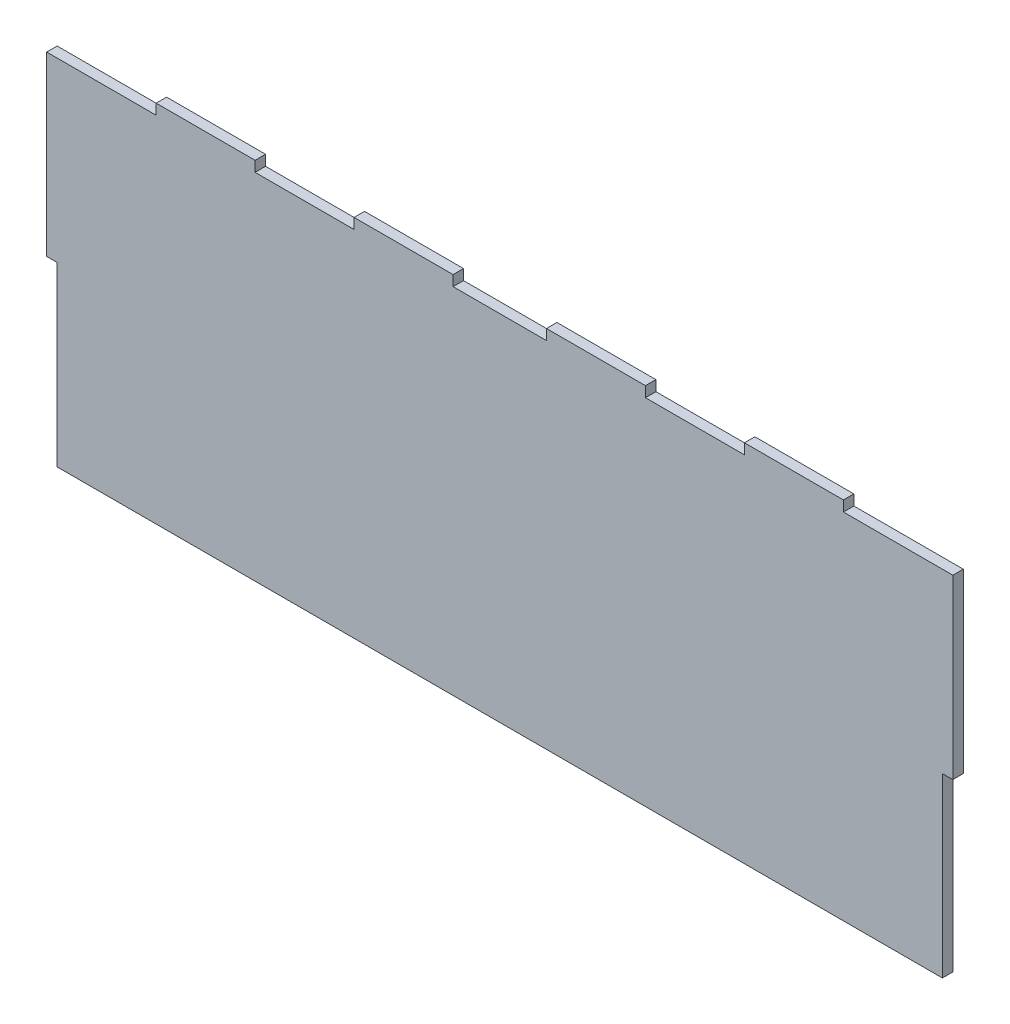
ISO-10303-21;
HEADER;
FILE_DESCRIPTION(('STEP AP214'),'2;1');
FILE_NAME('part.step','',(''),(''),'','','');
FILE_SCHEMA(('AUTOMOTIVE_DESIGN { 1 0 10303 214 1 1 1 1 }'));
ENDSEC;
DATA;
#1=APPLICATION_CONTEXT('core data for automotive mechanical design processes');
#2=APPLICATION_PROTOCOL_DEFINITION('international standard','automotive_design',2000,#1);
#3=PRODUCT_CONTEXT('',#1,'mechanical');
#4=PRODUCT('Part','Part','',(#3));
#5=PRODUCT_RELATED_PRODUCT_CATEGORY('part','',(#4));
#6=PRODUCT_DEFINITION_FORMATION('','',#4);
#7=PRODUCT_DEFINITION_CONTEXT('part definition',#1,'design');
#8=PRODUCT_DEFINITION('design','',#6,#7);
#9=PRODUCT_DEFINITION_SHAPE('','',#8);
#10=(LENGTH_UNIT() NAMED_UNIT(*) SI_UNIT(.MILLI.,.METRE.));
#11=(NAMED_UNIT(*) PLANE_ANGLE_UNIT() SI_UNIT($,.RADIAN.));
#12=(NAMED_UNIT(*) SI_UNIT($,.STERADIAN.) SOLID_ANGLE_UNIT());
#13=UNCERTAINTY_MEASURE_WITH_UNIT(LENGTH_MEASURE(1.E-05),#10,'distance_accuracy_value','');
#14=(GEOMETRIC_REPRESENTATION_CONTEXT(3) GLOBAL_UNCERTAINTY_ASSIGNED_CONTEXT((#13)) GLOBAL_UNIT_ASSIGNED_CONTEXT((#10,
#11,#12)) REPRESENTATION_CONTEXT('',''));
#15=CARTESIAN_POINT('',(0.,0.,0.));
#16=DIRECTION('',(0.,0.,1.));
#17=DIRECTION('',(1.,0.,0.));
#18=AXIS2_PLACEMENT_3D('',#15,#16,#17);
#19=CARTESIAN_POINT('',(3.00000000000001,50.8,3.));
#20=DIRECTION('',(1.,0.,0.));
#21=DIRECTION('',(0.,1.,0.));
#22=AXIS2_PLACEMENT_3D('',#19,#20,#21);
#23=PLANE('',#22);
#24=DIRECTION('',(0.,-1.,0.));
#25=VECTOR('',#24,1.);
#26=CARTESIAN_POINT('',(3.00000000000001,50.8,0.));
#27=LINE('',#26,#25);
#28=CARTESIAN_POINT('',(3.00000000000001,50.8,0.));
#29=VERTEX_POINT('',#28);
#30=CARTESIAN_POINT('',(3.00000000000002,0.,0.));
#31=VERTEX_POINT('',#30);
#32=EDGE_CURVE('E224',#29,#31,#27,.T.);
#33=ORIENTED_EDGE('',*,*,#32,.T.);
#34=DIRECTION('',(0.,0.,-1.));
#35=VECTOR('',#34,1.);
#36=CARTESIAN_POINT('',(3.00000000000002,0.,3.));
#37=LINE('',#36,#35);
#38=CARTESIAN_POINT('',(3.00000000000002,0.,3.));
#39=VERTEX_POINT('',#38);
#40=EDGE_CURVE('E11',#39,#31,#37,.T.);
#41=ORIENTED_EDGE('',*,*,#40,.F.);
#42=DIRECTION('',(0.,-1.,0.));
#43=VECTOR('',#42,1.);
#44=CARTESIAN_POINT('',(3.00000000000001,50.8,3.));
#45=LINE('',#44,#43);
#46=CARTESIAN_POINT('',(3.00000000000001,50.8,3.));
#47=VERTEX_POINT('',#46);
#48=EDGE_CURVE('E272',#47,#39,#45,.T.);
#49=ORIENTED_EDGE('',*,*,#48,.F.);
#50=DIRECTION('',(0.,0.,-1.));
#51=VECTOR('',#50,1.);
#52=CARTESIAN_POINT('',(3.00000000000001,50.8,3.));
#53=LINE('',#52,#51);
#54=EDGE_CURVE('E220',#47,#29,#53,.T.);
#55=ORIENTED_EDGE('',*,*,#54,.T.);
#56=EDGE_LOOP('',(#33,#41,#49,#55));
#57=FACE_BOUND('',#56,.T.);
#58=ADVANCED_FACE('F33',(#57),#23,.F.);
#59=CARTESIAN_POINT('',(3.00000000000002,0.,3.));
#60=DIRECTION('',(0.,1.,0.));
#61=DIRECTION('',(-1.,0.,0.));
#62=AXIS2_PLACEMENT_3D('',#59,#60,#61);
#63=PLANE('',#62);
#64=DIRECTION('',(1.,0.,0.));
#65=VECTOR('',#64,1.);
#66=CARTESIAN_POINT('',(3.00000000000002,0.,0.));
#67=LINE('',#66,#65);
#68=CARTESIAN_POINT('',(257.,0.,0.));
#69=VERTEX_POINT('',#68);
#70=EDGE_CURVE('E227',#31,#69,#67,.T.);
#71=ORIENTED_EDGE('',*,*,#70,.T.);
#72=DIRECTION('',(0.,0.,-1.));
#73=VECTOR('',#72,1.);
#74=CARTESIAN_POINT('',(257.,0.,3.));
#75=LINE('',#74,#73);
#76=CARTESIAN_POINT('',(257.,0.,3.));
#77=VERTEX_POINT('',#76);
#78=EDGE_CURVE('E41',#77,#69,#75,.T.);
#79=ORIENTED_EDGE('',*,*,#78,.F.);
#80=DIRECTION('',(1.,0.,0.));
#81=VECTOR('',#80,1.);
#82=CARTESIAN_POINT('',(3.00000000000002,0.,3.));
#83=LINE('',#82,#81);
#84=EDGE_CURVE('E140',#39,#77,#83,.T.);
#85=ORIENTED_EDGE('',*,*,#84,.F.);
#86=ORIENTED_EDGE('',*,*,#40,.T.);
#87=EDGE_LOOP('',(#71,#79,#85,#86));
#88=FACE_BOUND('',#87,.T.);
#89=ADVANCED_FACE('F410',(#88),#63,.F.);
#90=CARTESIAN_POINT('',(257.,50.8,3.));
#91=DIRECTION('',(-1.,0.,0.));
#92=DIRECTION('',(0.,0.,1.));
#93=AXIS2_PLACEMENT_3D('',#90,#91,#92);
#94=PLANE('',#93);
#95=DIRECTION('',(0.,1.,0.));
#96=VECTOR('',#95,1.);
#97=CARTESIAN_POINT('',(257.,50.8,0.));
#98=LINE('',#97,#96);
#99=CARTESIAN_POINT('',(257.,50.8,0.));
#100=VERTEX_POINT('',#99);
#101=EDGE_CURVE('E229',#69,#100,#98,.T.);
#102=ORIENTED_EDGE('',*,*,#101,.T.);
#103=DIRECTION('',(0.,0.,-1.));
#104=VECTOR('',#103,1.);
#105=CARTESIAN_POINT('',(257.,50.8,3.));
#106=LINE('',#105,#104);
#107=CARTESIAN_POINT('',(257.,50.8,3.));
#108=VERTEX_POINT('',#107);
#109=EDGE_CURVE('E327',#108,#100,#106,.T.);
#110=ORIENTED_EDGE('',*,*,#109,.F.);
#111=DIRECTION('',(0.,1.,0.));
#112=VECTOR('',#111,1.);
#113=CARTESIAN_POINT('',(257.,50.8,3.));
#114=LINE('',#113,#112);
#115=EDGE_CURVE('E335',#77,#108,#114,.T.);
#116=ORIENTED_EDGE('',*,*,#115,.F.);
#117=ORIENTED_EDGE('',*,*,#78,.T.);
#118=EDGE_LOOP('',(#102,#110,#116,#117));
#119=FACE_BOUND('',#118,.T.);
#120=ADVANCED_FACE('F333',(#119),#94,.F.);
#121=CARTESIAN_POINT('',(260.,50.8000000000002,3.));
#122=DIRECTION('',(0.,1.,0.));
#123=DIRECTION('',(-1.,0.,0.));
#124=AXIS2_PLACEMENT_3D('',#121,#122,#123);
#125=PLANE('',#124);
#126=DIRECTION('',(1.,0.,0.));
#127=VECTOR('',#126,1.);
#128=CARTESIAN_POINT('',(260.,50.8000000000002,0.));
#129=LINE('',#128,#127);
#130=CARTESIAN_POINT('',(260.,50.8000000000002,0.));
#131=VERTEX_POINT('',#130);
#132=EDGE_CURVE('E231',#100,#131,#129,.T.);
#133=ORIENTED_EDGE('',*,*,#132,.T.);
#134=DIRECTION('',(0.,0.,-1.));
#135=VECTOR('',#134,1.);
#136=CARTESIAN_POINT('',(260.,50.8000000000002,3.));
#137=LINE('',#136,#135);
#138=CARTESIAN_POINT('',(260.,50.8000000000002,3.));
#139=VERTEX_POINT('',#138);
#140=EDGE_CURVE('E324',#139,#131,#137,.T.);
#141=ORIENTED_EDGE('',*,*,#140,.F.);
#142=DIRECTION('',(1.,0.,0.));
#143=VECTOR('',#142,1.);
#144=CARTESIAN_POINT('',(260.,50.8000000000002,3.));
#145=LINE('',#144,#143);
#146=EDGE_CURVE('E352',#108,#139,#145,.T.);
#147=ORIENTED_EDGE('',*,*,#146,.F.);
#148=ORIENTED_EDGE('',*,*,#109,.T.);
#149=EDGE_LOOP('',(#133,#141,#147,#148));
#150=FACE_BOUND('',#149,.T.);
#151=ADVANCED_FACE('F343',(#150),#125,.F.);
#152=CARTESIAN_POINT('',(260.,101.6,3.));
#153=DIRECTION('',(-1.,0.,0.));
#154=DIRECTION('',(0.,-1.,0.));
#155=AXIS2_PLACEMENT_3D('',#152,#153,#154);
#156=PLANE('',#155);
#157=DIRECTION('',(0.,1.,0.));
#158=VECTOR('',#157,1.);
#159=CARTESIAN_POINT('',(260.,101.6,0.));
#160=LINE('',#159,#158);
#161=CARTESIAN_POINT('',(260.,101.6,0.));
#162=VERTEX_POINT('',#161);
#163=EDGE_CURVE('E233',#131,#162,#160,.T.);
#164=ORIENTED_EDGE('',*,*,#163,.T.);
#165=DIRECTION('',(0.,0.,-1.));
#166=VECTOR('',#165,1.);
#167=CARTESIAN_POINT('',(260.,101.6,3.));
#168=LINE('',#167,#166);
#169=CARTESIAN_POINT('',(260.,101.6,3.));
#170=VERTEX_POINT('',#169);
#171=EDGE_CURVE('E321',#170,#162,#168,.T.);
#172=ORIENTED_EDGE('',*,*,#171,.F.);
#173=DIRECTION('',(0.,1.,0.));
#174=VECTOR('',#173,1.);
#175=CARTESIAN_POINT('',(260.,101.6,3.));
#176=LINE('',#175,#174);
#177=EDGE_CURVE('E349',#139,#170,#176,.T.);
#178=ORIENTED_EDGE('',*,*,#177,.F.);
#179=ORIENTED_EDGE('',*,*,#140,.T.);
#180=EDGE_LOOP('',(#164,#172,#178,#179));
#181=FACE_BOUND('',#180,.T.);
#182=ADVANCED_FACE('F347',(#181),#156,.F.);
#183=CARTESIAN_POINT('',(257.,101.6,3.));
#184=DIRECTION('',(0.,-1.,0.));
#185=DIRECTION('',(0.,0.,-1.));
#186=AXIS2_PLACEMENT_3D('',#183,#184,#185);
#187=PLANE('',#186);
#188=DIRECTION('',(-1.,0.,0.));
#189=VECTOR('',#188,1.);
#190=CARTESIAN_POINT('',(257.,101.6,0.));
#191=LINE('',#190,#189);
#192=CARTESIAN_POINT('',(228.6,101.6,0.));
#193=VERTEX_POINT('',#192);
#194=EDGE_CURVE('E236',#162,#193,#191,.T.);
#195=ORIENTED_EDGE('',*,*,#194,.T.);
#196=DIRECTION('',(0.,0.,-1.));
#197=VECTOR('',#196,1.);
#198=CARTESIAN_POINT('',(228.6,101.6,3.));
#199=LINE('',#198,#197);
#200=CARTESIAN_POINT('',(228.6,101.6,3.));
#201=VERTEX_POINT('',#200);
#202=EDGE_CURVE('E318',#201,#193,#199,.T.);
#203=ORIENTED_EDGE('',*,*,#202,.F.);
#204=DIRECTION('',(-1.,0.,0.));
#205=VECTOR('',#204,1.);
#206=CARTESIAN_POINT('',(260.,101.6,3.));
#207=LINE('',#206,#205);
#208=EDGE_CURVE('E351',#170,#201,#207,.T.);
#209=ORIENTED_EDGE('',*,*,#208,.F.);
#210=ORIENTED_EDGE('',*,*,#171,.T.);
#211=EDGE_LOOP('',(#195,#203,#209,#210));
#212=FACE_BOUND('',#211,.T.);
#213=ADVANCED_FACE('F423',(#212),#187,.F.);
#214=CARTESIAN_POINT('',(228.6,101.6,3.));
#215=DIRECTION('',(-1.,0.,0.));
#216=DIRECTION('',(0.,0.,1.));
#217=AXIS2_PLACEMENT_3D('',#214,#215,#216);
#218=PLANE('',#217);
#219=DIRECTION('',(0.,1.,0.));
#220=VECTOR('',#219,1.);
#221=CARTESIAN_POINT('',(228.6,101.6,0.));
#222=LINE('',#221,#220);
#223=CARTESIAN_POINT('',(228.6,104.6,0.));
#224=VERTEX_POINT('',#223);
#225=EDGE_CURVE('E238',#193,#224,#222,.T.);
#226=ORIENTED_EDGE('',*,*,#225,.T.);
#227=DIRECTION('',(0.,0.,-1.));
#228=VECTOR('',#227,1.);
#229=CARTESIAN_POINT('',(228.6,104.6,3.));
#230=LINE('',#229,#228);
#231=CARTESIAN_POINT('',(228.6,104.6,3.));
#232=VERTEX_POINT('',#231);
#233=EDGE_CURVE('E315',#232,#224,#230,.T.);
#234=ORIENTED_EDGE('',*,*,#233,.F.);
#235=DIRECTION('',(0.,1.,0.));
#236=VECTOR('',#235,1.);
#237=CARTESIAN_POINT('',(228.6,101.6,3.));
#238=LINE('',#237,#236);
#239=EDGE_CURVE('E354',#201,#232,#238,.T.);
#240=ORIENTED_EDGE('',*,*,#239,.F.);
#241=ORIENTED_EDGE('',*,*,#202,.T.);
#242=EDGE_LOOP('',(#226,#234,#240,#241));
#243=FACE_BOUND('',#242,.T.);
#244=ADVANCED_FACE('F426',(#243),#218,.F.);
#245=CARTESIAN_POINT('',(228.6,104.6,3.));
#246=DIRECTION('',(0.,-1.,0.));
#247=DIRECTION('',(0.,0.,-1.));
#248=AXIS2_PLACEMENT_3D('',#245,#246,#247);
#249=PLANE('',#248);
#250=DIRECTION('',(-1.,0.,0.));
#251=VECTOR('',#250,1.);
#252=CARTESIAN_POINT('',(228.6,104.6,0.));
#253=LINE('',#252,#251);
#254=CARTESIAN_POINT('',(200.2,104.6,0.));
#255=VERTEX_POINT('',#254);
#256=EDGE_CURVE('E240',#224,#255,#253,.T.);
#257=ORIENTED_EDGE('',*,*,#256,.T.);
#258=DIRECTION('',(0.,0.,-1.));
#259=VECTOR('',#258,1.);
#260=CARTESIAN_POINT('',(200.2,104.6,3.));
#261=LINE('',#260,#259);
#262=CARTESIAN_POINT('',(200.2,104.6,3.));
#263=VERTEX_POINT('',#262);
#264=EDGE_CURVE('E312',#263,#255,#261,.T.);
#265=ORIENTED_EDGE('',*,*,#264,.F.);
#266=DIRECTION('',(-1.,0.,0.));
#267=VECTOR('',#266,1.);
#268=CARTESIAN_POINT('',(228.6,104.6,3.));
#269=LINE('',#268,#267);
#270=EDGE_CURVE('E360',#232,#263,#269,.T.);
#271=ORIENTED_EDGE('',*,*,#270,.F.);
#272=ORIENTED_EDGE('',*,*,#233,.T.);
#273=EDGE_LOOP('',(#257,#265,#271,#272));
#274=FACE_BOUND('',#273,.T.);
#275=ADVANCED_FACE('F430',(#274),#249,.F.);
#276=CARTESIAN_POINT('',(200.2,104.6,3.));
#277=DIRECTION('',(1.,0.,0.));
#278=DIRECTION('',(0.,0.,-1.));
#279=AXIS2_PLACEMENT_3D('',#276,#277,#278);
#280=PLANE('',#279);
#281=DIRECTION('',(0.,-1.,0.));
#282=VECTOR('',#281,1.);
#283=CARTESIAN_POINT('',(200.2,104.6,0.));
#284=LINE('',#283,#282);
#285=CARTESIAN_POINT('',(200.2,101.6,0.));
#286=VERTEX_POINT('',#285);
#287=EDGE_CURVE('E242',#255,#286,#284,.T.);
#288=ORIENTED_EDGE('',*,*,#287,.T.);
#289=DIRECTION('',(0.,0.,-1.));
#290=VECTOR('',#289,1.);
#291=CARTESIAN_POINT('',(200.2,101.6,3.));
#292=LINE('',#291,#290);
#293=CARTESIAN_POINT('',(200.2,101.6,3.));
#294=VERTEX_POINT('',#293);
#295=EDGE_CURVE('E309',#294,#286,#292,.T.);
#296=ORIENTED_EDGE('',*,*,#295,.F.);
#297=DIRECTION('',(0.,-1.,0.));
#298=VECTOR('',#297,1.);
#299=CARTESIAN_POINT('',(200.2,104.6,3.));
#300=LINE('',#299,#298);
#301=EDGE_CURVE('E362',#263,#294,#300,.T.);
#302=ORIENTED_EDGE('',*,*,#301,.F.);
#303=ORIENTED_EDGE('',*,*,#264,.T.);
#304=EDGE_LOOP('',(#288,#296,#302,#303));
#305=FACE_BOUND('',#304,.T.);
#306=ADVANCED_FACE('F434',(#305),#280,.F.);
#307=CARTESIAN_POINT('',(200.2,101.6,3.));
#308=DIRECTION('',(0.,-1.,0.));
#309=DIRECTION('',(0.,0.,-1.));
#310=AXIS2_PLACEMENT_3D('',#307,#308,#309);
#311=PLANE('',#310);
#312=DIRECTION('',(-1.,0.,0.));
#313=VECTOR('',#312,1.);
#314=CARTESIAN_POINT('',(200.2,101.6,0.));
#315=LINE('',#314,#313);
#316=CARTESIAN_POINT('',(171.8,101.6,0.));
#317=VERTEX_POINT('',#316);
#318=EDGE_CURVE('E244',#286,#317,#315,.T.);
#319=ORIENTED_EDGE('',*,*,#318,.T.);
#320=DIRECTION('',(0.,0.,-1.));
#321=VECTOR('',#320,1.);
#322=CARTESIAN_POINT('',(171.8,101.6,3.));
#323=LINE('',#322,#321);
#324=CARTESIAN_POINT('',(171.8,101.6,3.));
#325=VERTEX_POINT('',#324);
#326=EDGE_CURVE('E306',#325,#317,#323,.T.);
#327=ORIENTED_EDGE('',*,*,#326,.F.);
#328=DIRECTION('',(-1.,0.,0.));
#329=VECTOR('',#328,1.);
#330=CARTESIAN_POINT('',(200.2,101.6,3.));
#331=LINE('',#330,#329);
#332=EDGE_CURVE('E364',#294,#325,#331,.T.);
#333=ORIENTED_EDGE('',*,*,#332,.F.);
#334=ORIENTED_EDGE('',*,*,#295,.T.);
#335=EDGE_LOOP('',(#319,#327,#333,#334));
#336=FACE_BOUND('',#335,.T.);
#337=ADVANCED_FACE('F438',(#336),#311,.F.);
#338=CARTESIAN_POINT('',(171.8,101.6,3.));
#339=DIRECTION('',(-1.,0.,0.));
#340=DIRECTION('',(0.,-1.,0.));
#341=AXIS2_PLACEMENT_3D('',#338,#339,#340);
#342=PLANE('',#341);
#343=DIRECTION('',(0.,1.,0.));
#344=VECTOR('',#343,1.);
#345=CARTESIAN_POINT('',(171.8,101.6,0.));
#346=LINE('',#345,#344);
#347=CARTESIAN_POINT('',(171.8,104.6,0.));
#348=VERTEX_POINT('',#347);
#349=EDGE_CURVE('E246',#317,#348,#346,.T.);
#350=ORIENTED_EDGE('',*,*,#349,.T.);
#351=DIRECTION('',(0.,0.,-1.));
#352=VECTOR('',#351,1.);
#353=CARTESIAN_POINT('',(171.8,104.6,3.));
#354=LINE('',#353,#352);
#355=CARTESIAN_POINT('',(171.8,104.6,3.));
#356=VERTEX_POINT('',#355);
#357=EDGE_CURVE('E303',#356,#348,#354,.T.);
#358=ORIENTED_EDGE('',*,*,#357,.F.);
#359=DIRECTION('',(0.,1.,0.));
#360=VECTOR('',#359,1.);
#361=CARTESIAN_POINT('',(171.8,101.6,3.));
#362=LINE('',#361,#360);
#363=EDGE_CURVE('E366',#325,#356,#362,.T.);
#364=ORIENTED_EDGE('',*,*,#363,.F.);
#365=ORIENTED_EDGE('',*,*,#326,.T.);
#366=EDGE_LOOP('',(#350,#358,#364,#365));
#367=FACE_BOUND('',#366,.T.);
#368=ADVANCED_FACE('F442',(#367),#342,.F.);
#369=CARTESIAN_POINT('',(171.8,104.6,3.));
#370=DIRECTION('',(0.,-1.,0.));
#371=DIRECTION('',(0.,0.,-1.));
#372=AXIS2_PLACEMENT_3D('',#369,#370,#371);
#373=PLANE('',#372);
#374=DIRECTION('',(-1.,0.,0.));
#375=VECTOR('',#374,1.);
#376=CARTESIAN_POINT('',(171.8,104.6,0.));
#377=LINE('',#376,#375);
#378=CARTESIAN_POINT('',(143.4,104.6,0.));
#379=VERTEX_POINT('',#378);
#380=EDGE_CURVE('E248',#348,#379,#377,.T.);
#381=ORIENTED_EDGE('',*,*,#380,.T.);
#382=DIRECTION('',(0.,0.,-1.));
#383=VECTOR('',#382,1.);
#384=CARTESIAN_POINT('',(143.4,104.6,3.));
#385=LINE('',#384,#383);
#386=CARTESIAN_POINT('',(143.4,104.6,3.));
#387=VERTEX_POINT('',#386);
#388=EDGE_CURVE('E300',#387,#379,#385,.T.);
#389=ORIENTED_EDGE('',*,*,#388,.F.);
#390=DIRECTION('',(-1.,0.,0.));
#391=VECTOR('',#390,1.);
#392=CARTESIAN_POINT('',(171.8,104.6,3.));
#393=LINE('',#392,#391);
#394=EDGE_CURVE('E368',#356,#387,#393,.T.);
#395=ORIENTED_EDGE('',*,*,#394,.F.);
#396=ORIENTED_EDGE('',*,*,#357,.T.);
#397=EDGE_LOOP('',(#381,#389,#395,#396));
#398=FACE_BOUND('',#397,.T.);
#399=ADVANCED_FACE('F446',(#398),#373,.F.);
#400=CARTESIAN_POINT('',(143.4,104.6,3.));
#401=DIRECTION('',(1.,0.,0.));
#402=DIRECTION('',(0.,0.,-1.));
#403=AXIS2_PLACEMENT_3D('',#400,#401,#402);
#404=PLANE('',#403);
#405=DIRECTION('',(0.,-1.,0.));
#406=VECTOR('',#405,1.);
#407=CARTESIAN_POINT('',(143.4,104.6,0.));
#408=LINE('',#407,#406);
#409=CARTESIAN_POINT('',(143.4,101.6,0.));
#410=VERTEX_POINT('',#409);
#411=EDGE_CURVE('E250',#379,#410,#408,.T.);
#412=ORIENTED_EDGE('',*,*,#411,.T.);
#413=DIRECTION('',(0.,0.,-1.));
#414=VECTOR('',#413,1.);
#415=CARTESIAN_POINT('',(143.4,101.6,3.));
#416=LINE('',#415,#414);
#417=CARTESIAN_POINT('',(143.4,101.6,3.));
#418=VERTEX_POINT('',#417);
#419=EDGE_CURVE('E297',#418,#410,#416,.T.);
#420=ORIENTED_EDGE('',*,*,#419,.F.);
#421=DIRECTION('',(0.,-1.,0.));
#422=VECTOR('',#421,1.);
#423=CARTESIAN_POINT('',(143.4,104.6,3.));
#424=LINE('',#423,#422);
#425=EDGE_CURVE('E370',#387,#418,#424,.T.);
#426=ORIENTED_EDGE('',*,*,#425,.F.);
#427=ORIENTED_EDGE('',*,*,#388,.T.);
#428=EDGE_LOOP('',(#412,#420,#426,#427));
#429=FACE_BOUND('',#428,.T.);
#430=ADVANCED_FACE('F450',(#429),#404,.F.);
#431=CARTESIAN_POINT('',(116.6,101.6,3.));
#432=DIRECTION('',(0.,-1.,0.));
#433=DIRECTION('',(0.,0.,-1.));
#434=AXIS2_PLACEMENT_3D('',#431,#432,#433);
#435=PLANE('',#434);
#436=DIRECTION('',(-1.,0.,0.));
#437=VECTOR('',#436,1.);
#438=CARTESIAN_POINT('',(116.6,101.6,0.));
#439=LINE('',#438,#437);
#440=CARTESIAN_POINT('',(116.6,101.6,0.));
#441=VERTEX_POINT('',#440);
#442=EDGE_CURVE('E252',#410,#441,#439,.T.);
#443=ORIENTED_EDGE('',*,*,#442,.T.);
#444=DIRECTION('',(0.,0.,-1.));
#445=VECTOR('',#444,1.);
#446=CARTESIAN_POINT('',(116.6,101.6,3.));
#447=LINE('',#446,#445);
#448=CARTESIAN_POINT('',(116.6,101.6,3.));
#449=VERTEX_POINT('',#448);
#450=EDGE_CURVE('E294',#449,#441,#447,.T.);
#451=ORIENTED_EDGE('',*,*,#450,.F.);
#452=DIRECTION('',(-1.,0.,0.));
#453=VECTOR('',#452,1.);
#454=CARTESIAN_POINT('',(116.6,101.6,3.));
#455=LINE('',#454,#453);
#456=EDGE_CURVE('E372',#418,#449,#455,.T.);
#457=ORIENTED_EDGE('',*,*,#456,.F.);
#458=ORIENTED_EDGE('',*,*,#419,.T.);
#459=EDGE_LOOP('',(#443,#451,#457,#458));
#460=FACE_BOUND('',#459,.T.);
#461=ADVANCED_FACE('F454',(#460),#435,.F.);
#462=CARTESIAN_POINT('',(116.6,104.6,3.));
#463=DIRECTION('',(-1.,0.,0.));
#464=DIRECTION('',(0.,-1.,0.));
#465=AXIS2_PLACEMENT_3D('',#462,#463,#464);
#466=PLANE('',#465);
#467=DIRECTION('',(0.,1.,0.));
#468=VECTOR('',#467,1.);
#469=CARTESIAN_POINT('',(116.6,104.6,0.));
#470=LINE('',#469,#468);
#471=CARTESIAN_POINT('',(116.6,104.6,0.));
#472=VERTEX_POINT('',#471);
#473=EDGE_CURVE('E254',#441,#472,#470,.T.);
#474=ORIENTED_EDGE('',*,*,#473,.T.);
#475=DIRECTION('',(0.,0.,-1.));
#476=VECTOR('',#475,1.);
#477=CARTESIAN_POINT('',(116.6,104.6,3.));
#478=LINE('',#477,#476);
#479=CARTESIAN_POINT('',(116.6,104.6,3.));
#480=VERTEX_POINT('',#479);
#481=EDGE_CURVE('E291',#480,#472,#478,.T.);
#482=ORIENTED_EDGE('',*,*,#481,.F.);
#483=DIRECTION('',(0.,1.,0.));
#484=VECTOR('',#483,1.);
#485=CARTESIAN_POINT('',(116.6,104.6,3.));
#486=LINE('',#485,#484);
#487=EDGE_CURVE('E374',#449,#480,#486,.T.);
#488=ORIENTED_EDGE('',*,*,#487,.F.);
#489=ORIENTED_EDGE('',*,*,#450,.T.);
#490=EDGE_LOOP('',(#474,#482,#488,#489));
#491=FACE_BOUND('',#490,.T.);
#492=ADVANCED_FACE('F458',(#491),#466,.F.);
#493=CARTESIAN_POINT('',(88.2,104.6,3.));
#494=DIRECTION('',(0.,-1.,0.));
#495=DIRECTION('',(0.,0.,-1.));
#496=AXIS2_PLACEMENT_3D('',#493,#494,#495);
#497=PLANE('',#496);
#498=DIRECTION('',(-1.,0.,0.));
#499=VECTOR('',#498,1.);
#500=CARTESIAN_POINT('',(88.2,104.6,0.));
#501=LINE('',#500,#499);
#502=CARTESIAN_POINT('',(88.2,104.6,0.));
#503=VERTEX_POINT('',#502);
#504=EDGE_CURVE('E256',#472,#503,#501,.T.);
#505=ORIENTED_EDGE('',*,*,#504,.T.);
#506=DIRECTION('',(0.,0.,-1.));
#507=VECTOR('',#506,1.);
#508=CARTESIAN_POINT('',(88.2,104.6,3.));
#509=LINE('',#508,#507);
#510=CARTESIAN_POINT('',(88.2,104.6,3.));
#511=VERTEX_POINT('',#510);
#512=EDGE_CURVE('E288',#511,#503,#509,.T.);
#513=ORIENTED_EDGE('',*,*,#512,.F.);
#514=DIRECTION('',(-1.,0.,0.));
#515=VECTOR('',#514,1.);
#516=CARTESIAN_POINT('',(88.2,104.6,3.));
#517=LINE('',#516,#515);
#518=EDGE_CURVE('E376',#480,#511,#517,.T.);
#519=ORIENTED_EDGE('',*,*,#518,.F.);
#520=ORIENTED_EDGE('',*,*,#481,.T.);
#521=EDGE_LOOP('',(#505,#513,#519,#520));
#522=FACE_BOUND('',#521,.T.);
#523=ADVANCED_FACE('F462',(#522),#497,.F.);
#524=CARTESIAN_POINT('',(88.2,101.6,3.));
#525=DIRECTION('',(1.,0.,0.));
#526=DIRECTION('',(0.,1.,0.));
#527=AXIS2_PLACEMENT_3D('',#524,#525,#526);
#528=PLANE('',#527);
#529=DIRECTION('',(0.,-1.,0.));
#530=VECTOR('',#529,1.);
#531=CARTESIAN_POINT('',(88.2,101.6,0.));
#532=LINE('',#531,#530);
#533=CARTESIAN_POINT('',(88.2,101.6,0.));
#534=VERTEX_POINT('',#533);
#535=EDGE_CURVE('E258',#503,#534,#532,.T.);
#536=ORIENTED_EDGE('',*,*,#535,.T.);
#537=DIRECTION('',(0.,0.,-1.));
#538=VECTOR('',#537,1.);
#539=CARTESIAN_POINT('',(88.2,101.6,3.));
#540=LINE('',#539,#538);
#541=CARTESIAN_POINT('',(88.2,101.6,3.));
#542=VERTEX_POINT('',#541);
#543=EDGE_CURVE('E285',#542,#534,#540,.T.);
#544=ORIENTED_EDGE('',*,*,#543,.F.);
#545=DIRECTION('',(0.,-1.,0.));
#546=VECTOR('',#545,1.);
#547=CARTESIAN_POINT('',(88.2,101.6,3.));
#548=LINE('',#547,#546);
#549=EDGE_CURVE('E378',#511,#542,#548,.T.);
#550=ORIENTED_EDGE('',*,*,#549,.F.);
#551=ORIENTED_EDGE('',*,*,#512,.T.);
#552=EDGE_LOOP('',(#536,#544,#550,#551));
#553=FACE_BOUND('',#552,.T.);
#554=ADVANCED_FACE('F466',(#553),#528,.F.);
#555=CARTESIAN_POINT('',(59.8,101.6,3.));
#556=DIRECTION('',(0.,-1.,0.));
#557=DIRECTION('',(0.,0.,-1.));
#558=AXIS2_PLACEMENT_3D('',#555,#556,#557);
#559=PLANE('',#558);
#560=DIRECTION('',(-1.,0.,0.));
#561=VECTOR('',#560,1.);
#562=CARTESIAN_POINT('',(59.8,101.6,0.));
#563=LINE('',#562,#561);
#564=CARTESIAN_POINT('',(59.8,101.6,0.));
#565=VERTEX_POINT('',#564);
#566=EDGE_CURVE('E260',#534,#565,#563,.T.);
#567=ORIENTED_EDGE('',*,*,#566,.T.);
#568=DIRECTION('',(0.,0.,-1.));
#569=VECTOR('',#568,1.);
#570=CARTESIAN_POINT('',(59.8,101.6,3.));
#571=LINE('',#570,#569);
#572=CARTESIAN_POINT('',(59.8,101.6,3.));
#573=VERTEX_POINT('',#572);
#574=EDGE_CURVE('E282',#573,#565,#571,.T.);
#575=ORIENTED_EDGE('',*,*,#574,.F.);
#576=DIRECTION('',(-1.,0.,0.));
#577=VECTOR('',#576,1.);
#578=CARTESIAN_POINT('',(59.8,101.6,3.));
#579=LINE('',#578,#577);
#580=EDGE_CURVE('E380',#542,#573,#579,.T.);
#581=ORIENTED_EDGE('',*,*,#580,.F.);
#582=ORIENTED_EDGE('',*,*,#543,.T.);
#583=EDGE_LOOP('',(#567,#575,#581,#582));
#584=FACE_BOUND('',#583,.T.);
#585=ADVANCED_FACE('F470',(#584),#559,.F.);
#586=CARTESIAN_POINT('',(59.8,104.6,3.));
#587=DIRECTION('',(-1.,0.,0.));
#588=DIRECTION('',(0.,0.,1.));
#589=AXIS2_PLACEMENT_3D('',#586,#587,#588);
#590=PLANE('',#589);
#591=DIRECTION('',(0.,1.,0.));
#592=VECTOR('',#591,1.);
#593=CARTESIAN_POINT('',(59.8,104.6,0.));
#594=LINE('',#593,#592);
#595=CARTESIAN_POINT('',(59.8,104.6,0.));
#596=VERTEX_POINT('',#595);
#597=EDGE_CURVE('E262',#565,#596,#594,.T.);
#598=ORIENTED_EDGE('',*,*,#597,.T.);
#599=DIRECTION('',(0.,0.,-1.));
#600=VECTOR('',#599,1.);
#601=CARTESIAN_POINT('',(59.8,104.6,3.));
#602=LINE('',#601,#600);
#603=CARTESIAN_POINT('',(59.8,104.6,3.));
#604=VERTEX_POINT('',#603);
#605=EDGE_CURVE('E279',#604,#596,#602,.T.);
#606=ORIENTED_EDGE('',*,*,#605,.F.);
#607=DIRECTION('',(0.,1.,0.));
#608=VECTOR('',#607,1.);
#609=CARTESIAN_POINT('',(59.8,104.6,3.));
#610=LINE('',#609,#608);
#611=EDGE_CURVE('E382',#573,#604,#610,.T.);
#612=ORIENTED_EDGE('',*,*,#611,.F.);
#613=ORIENTED_EDGE('',*,*,#574,.T.);
#614=EDGE_LOOP('',(#598,#606,#612,#613));
#615=FACE_BOUND('',#614,.T.);
#616=ADVANCED_FACE('F474',(#615),#590,.F.);
#617=CARTESIAN_POINT('',(31.4,104.6,3.));
#618=DIRECTION('',(0.,-1.,0.));
#619=DIRECTION('',(0.,0.,-1.));
#620=AXIS2_PLACEMENT_3D('',#617,#618,#619);
#621=PLANE('',#620);
#622=DIRECTION('',(-1.,0.,0.));
#623=VECTOR('',#622,1.);
#624=CARTESIAN_POINT('',(31.4,104.6,0.));
#625=LINE('',#624,#623);
#626=CARTESIAN_POINT('',(31.4,104.6,0.));
#627=VERTEX_POINT('',#626);
#628=EDGE_CURVE('E264',#596,#627,#625,.T.);
#629=ORIENTED_EDGE('',*,*,#628,.T.);
#630=DIRECTION('',(0.,0.,-1.));
#631=VECTOR('',#630,1.);
#632=CARTESIAN_POINT('',(31.4,104.6,3.));
#633=LINE('',#632,#631);
#634=CARTESIAN_POINT('',(31.4,104.6,3.));
#635=VERTEX_POINT('',#634);
#636=EDGE_CURVE('E276',#635,#627,#633,.T.);
#637=ORIENTED_EDGE('',*,*,#636,.F.);
#638=DIRECTION('',(-1.,0.,0.));
#639=VECTOR('',#638,1.);
#640=CARTESIAN_POINT('',(31.4,104.6,3.));
#641=LINE('',#640,#639);
#642=EDGE_CURVE('E384',#604,#635,#641,.T.);
#643=ORIENTED_EDGE('',*,*,#642,.F.);
#644=ORIENTED_EDGE('',*,*,#605,.T.);
#645=EDGE_LOOP('',(#629,#637,#643,#644));
#646=FACE_BOUND('',#645,.T.);
#647=ADVANCED_FACE('F390',(#646),#621,.F.);
#648=CARTESIAN_POINT('',(31.4,101.6,3.));
#649=DIRECTION('',(1.,0.,0.));
#650=DIRECTION('',(0.,0.,-1.));
#651=AXIS2_PLACEMENT_3D('',#648,#649,#650);
#652=PLANE('',#651);
#653=DIRECTION('',(0.,-1.,0.));
#654=VECTOR('',#653,1.);
#655=CARTESIAN_POINT('',(31.4,101.6,0.));
#656=LINE('',#655,#654);
#657=CARTESIAN_POINT('',(31.4,101.6,0.));
#658=VERTEX_POINT('',#657);
#659=EDGE_CURVE('E266',#627,#658,#656,.T.);
#660=ORIENTED_EDGE('',*,*,#659,.T.);
#661=DIRECTION('',(0.,0.,-1.));
#662=VECTOR('',#661,1.);
#663=CARTESIAN_POINT('',(31.4,101.6,3.));
#664=LINE('',#663,#662);
#665=CARTESIAN_POINT('',(31.4,101.6,3.));
#666=VERTEX_POINT('',#665);
#667=EDGE_CURVE('E215',#666,#658,#664,.T.);
#668=ORIENTED_EDGE('',*,*,#667,.F.);
#669=DIRECTION('',(0.,-1.,0.));
#670=VECTOR('',#669,1.);
#671=CARTESIAN_POINT('',(31.4,101.6,3.));
#672=LINE('',#671,#670);
#673=EDGE_CURVE('E207',#635,#666,#672,.T.);
#674=ORIENTED_EDGE('',*,*,#673,.F.);
#675=ORIENTED_EDGE('',*,*,#636,.T.);
#676=EDGE_LOOP('',(#660,#668,#674,#675));
#677=FACE_BOUND('',#676,.T.);
#678=ADVANCED_FACE('F394',(#677),#652,.F.);
#679=CARTESIAN_POINT('',(0.,101.6,3.));
#680=DIRECTION('',(0.,-1.,0.));
#681=DIRECTION('',(0.,0.,-1.));
#682=AXIS2_PLACEMENT_3D('',#679,#680,#681);
#683=PLANE('',#682);
#684=DIRECTION('',(-1.,0.,0.));
#685=VECTOR('',#684,1.);
#686=CARTESIAN_POINT('',(0.,101.6,0.));
#687=LINE('',#686,#685);
#688=CARTESIAN_POINT('',(0.,101.6,0.));
#689=VERTEX_POINT('',#688);
#690=EDGE_CURVE('E214',#658,#689,#687,.T.);
#691=ORIENTED_EDGE('',*,*,#690,.T.);
#692=DIRECTION('',(0.,0.,-1.));
#693=VECTOR('',#692,1.);
#694=CARTESIAN_POINT('',(0.,101.6,3.));
#695=LINE('',#694,#693);
#696=CARTESIAN_POINT('',(0.,101.6,3.));
#697=VERTEX_POINT('',#696);
#698=EDGE_CURVE('E212',#697,#689,#695,.T.);
#699=ORIENTED_EDGE('',*,*,#698,.F.);
#700=DIRECTION('',(-1.,0.,0.));
#701=VECTOR('',#700,1.);
#702=CARTESIAN_POINT('',(2.99999999999998,101.6,3.));
#703=LINE('',#702,#701);
#704=EDGE_CURVE('E201',#666,#697,#703,.T.);
#705=ORIENTED_EDGE('',*,*,#704,.F.);
#706=ORIENTED_EDGE('',*,*,#667,.T.);
#707=EDGE_LOOP('',(#691,#699,#705,#706));
#708=FACE_BOUND('',#707,.T.);
#709=ADVANCED_FACE('F213',(#708),#683,.F.);
#710=CARTESIAN_POINT('',(0.,101.6,3.));
#711=DIRECTION('',(1.,0.,0.));
#712=DIRECTION('',(0.,1.,0.));
#713=AXIS2_PLACEMENT_3D('',#710,#711,#712);
#714=PLANE('',#713);
#715=DIRECTION('',(0.,-1.,0.));
#716=VECTOR('',#715,1.);
#717=CARTESIAN_POINT('',(0.,101.6,0.));
#718=LINE('',#717,#716);
#719=CARTESIAN_POINT('',(0.,50.8,0.));
#720=VERTEX_POINT('',#719);
#721=EDGE_CURVE('E126',#689,#720,#718,.T.);
#722=ORIENTED_EDGE('',*,*,#721,.T.);
#723=DIRECTION('',(0.,0.,-1.));
#724=VECTOR('',#723,1.);
#725=CARTESIAN_POINT('',(0.,50.8,3.));
#726=LINE('',#725,#724);
#727=CARTESIAN_POINT('',(0.,50.8,3.));
#728=VERTEX_POINT('',#727);
#729=EDGE_CURVE('E216',#728,#720,#726,.T.);
#730=ORIENTED_EDGE('',*,*,#729,.F.);
#731=DIRECTION('',(0.,-1.,0.));
#732=VECTOR('',#731,1.);
#733=CARTESIAN_POINT('',(0.,101.6,3.));
#734=LINE('',#733,#732);
#735=EDGE_CURVE('E205',#697,#728,#734,.T.);
#736=ORIENTED_EDGE('',*,*,#735,.F.);
#737=ORIENTED_EDGE('',*,*,#698,.T.);
#738=EDGE_LOOP('',(#722,#730,#736,#737));
#739=FACE_BOUND('',#738,.T.);
#740=ADVANCED_FACE('F218',(#739),#714,.F.);
#741=CARTESIAN_POINT('',(0.,50.8,3.));
#742=DIRECTION('',(0.,1.,0.));
#743=DIRECTION('',(0.,0.,1.));
#744=AXIS2_PLACEMENT_3D('',#741,#742,#743);
#745=PLANE('',#744);
#746=DIRECTION('',(1.,0.,0.));
#747=VECTOR('',#746,1.);
#748=CARTESIAN_POINT('',(0.,50.8,0.));
#749=LINE('',#748,#747);
#750=EDGE_CURVE('E132',#720,#29,#749,.T.);
#751=ORIENTED_EDGE('',*,*,#750,.T.);
#752=ORIENTED_EDGE('',*,*,#54,.F.);
#753=DIRECTION('',(1.,0.,0.));
#754=VECTOR('',#753,1.);
#755=CARTESIAN_POINT('',(0.,50.8,3.));
#756=LINE('',#755,#754);
#757=EDGE_CURVE('E49',#728,#47,#756,.T.);
#758=ORIENTED_EDGE('',*,*,#757,.F.);
#759=ORIENTED_EDGE('',*,*,#729,.T.);
#760=EDGE_LOOP('',(#751,#752,#758,#759));
#761=FACE_BOUND('',#760,.T.);
#762=ADVANCED_FACE('F399',(#761),#745,.F.);
#763=CARTESIAN_POINT('',(0.,0.,3.));
#764=DIRECTION('',(0.,0.,1.));
#765=DIRECTION('',(1.,0.,0.));
#766=AXIS2_PLACEMENT_3D('',#763,#764,#765);
#767=PLANE('',#766);
#768=ORIENTED_EDGE('',*,*,#48,.T.);
#769=ORIENTED_EDGE('',*,*,#84,.T.);
#770=ORIENTED_EDGE('',*,*,#115,.T.);
#771=ORIENTED_EDGE('',*,*,#146,.T.);
#772=ORIENTED_EDGE('',*,*,#177,.T.);
#773=ORIENTED_EDGE('',*,*,#208,.T.);
#774=ORIENTED_EDGE('',*,*,#239,.T.);
#775=ORIENTED_EDGE('',*,*,#270,.T.);
#776=ORIENTED_EDGE('',*,*,#301,.T.);
#777=ORIENTED_EDGE('',*,*,#332,.T.);
#778=ORIENTED_EDGE('',*,*,#363,.T.);
#779=ORIENTED_EDGE('',*,*,#394,.T.);
#780=ORIENTED_EDGE('',*,*,#425,.T.);
#781=ORIENTED_EDGE('',*,*,#456,.T.);
#782=ORIENTED_EDGE('',*,*,#487,.T.);
#783=ORIENTED_EDGE('',*,*,#518,.T.);
#784=ORIENTED_EDGE('',*,*,#549,.T.);
#785=ORIENTED_EDGE('',*,*,#580,.T.);
#786=ORIENTED_EDGE('',*,*,#611,.T.);
#787=ORIENTED_EDGE('',*,*,#642,.T.);
#788=ORIENTED_EDGE('',*,*,#673,.T.);
#789=ORIENTED_EDGE('',*,*,#704,.T.);
#790=ORIENTED_EDGE('',*,*,#735,.T.);
#791=ORIENTED_EDGE('',*,*,#757,.T.);
#792=EDGE_LOOP('',(#768,#769,#770,#771,#772,#773,#774,#775,#776,#777,#778,#779,#780,#781,#782,
#783,#784,#785,#786,#787,#788,#789,#790,#791));
#793=FACE_BOUND('',#792,.T.);
#794=ADVANCED_FACE('F203',(#793),#767,.T.);
#795=CARTESIAN_POINT('',(0.,0.,0.));
#796=DIRECTION('',(0.,0.,1.));
#797=DIRECTION('',(1.,0.,0.));
#798=AXIS2_PLACEMENT_3D('',#795,#796,#797);
#799=PLANE('',#798);
#800=ORIENTED_EDGE('',*,*,#32,.F.);
#801=ORIENTED_EDGE('',*,*,#750,.F.);
#802=ORIENTED_EDGE('',*,*,#721,.F.);
#803=ORIENTED_EDGE('',*,*,#690,.F.);
#804=ORIENTED_EDGE('',*,*,#659,.F.);
#805=ORIENTED_EDGE('',*,*,#628,.F.);
#806=ORIENTED_EDGE('',*,*,#597,.F.);
#807=ORIENTED_EDGE('',*,*,#566,.F.);
#808=ORIENTED_EDGE('',*,*,#535,.F.);
#809=ORIENTED_EDGE('',*,*,#504,.F.);
#810=ORIENTED_EDGE('',*,*,#473,.F.);
#811=ORIENTED_EDGE('',*,*,#442,.F.);
#812=ORIENTED_EDGE('',*,*,#411,.F.);
#813=ORIENTED_EDGE('',*,*,#380,.F.);
#814=ORIENTED_EDGE('',*,*,#349,.F.);
#815=ORIENTED_EDGE('',*,*,#318,.F.);
#816=ORIENTED_EDGE('',*,*,#287,.F.);
#817=ORIENTED_EDGE('',*,*,#256,.F.);
#818=ORIENTED_EDGE('',*,*,#225,.F.);
#819=ORIENTED_EDGE('',*,*,#194,.F.);
#820=ORIENTED_EDGE('',*,*,#163,.F.);
#821=ORIENTED_EDGE('',*,*,#132,.F.);
#822=ORIENTED_EDGE('',*,*,#101,.F.);
#823=ORIENTED_EDGE('',*,*,#70,.F.);
#824=EDGE_LOOP('',(#800,#801,#802,#803,#804,#805,#806,#807,#808,#809,#810,#811,#812,#813,#814,
#815,#816,#817,#818,#819,#820,#821,#822,#823));
#825=FACE_BOUND('',#824,.T.);
#826=ADVANCED_FACE('F339',(#825),#799,.F.);
#827=CLOSED_SHELL('',(#58,#89,#120,#151,#182,#213,#244,#275,#306,#337,#368,#399,#430,#461,#492,
#523,#554,#585,#616,#647,#678,#709,#740,#762,#794,#826));
#828=MANIFOLD_SOLID_BREP('B2',#827);
#829=ADVANCED_BREP_SHAPE_REPRESENTATION('',(#18,#828),#14);
#830=SHAPE_DEFINITION_REPRESENTATION(#9,#829);
ENDSEC;
END-ISO-10303-21;
